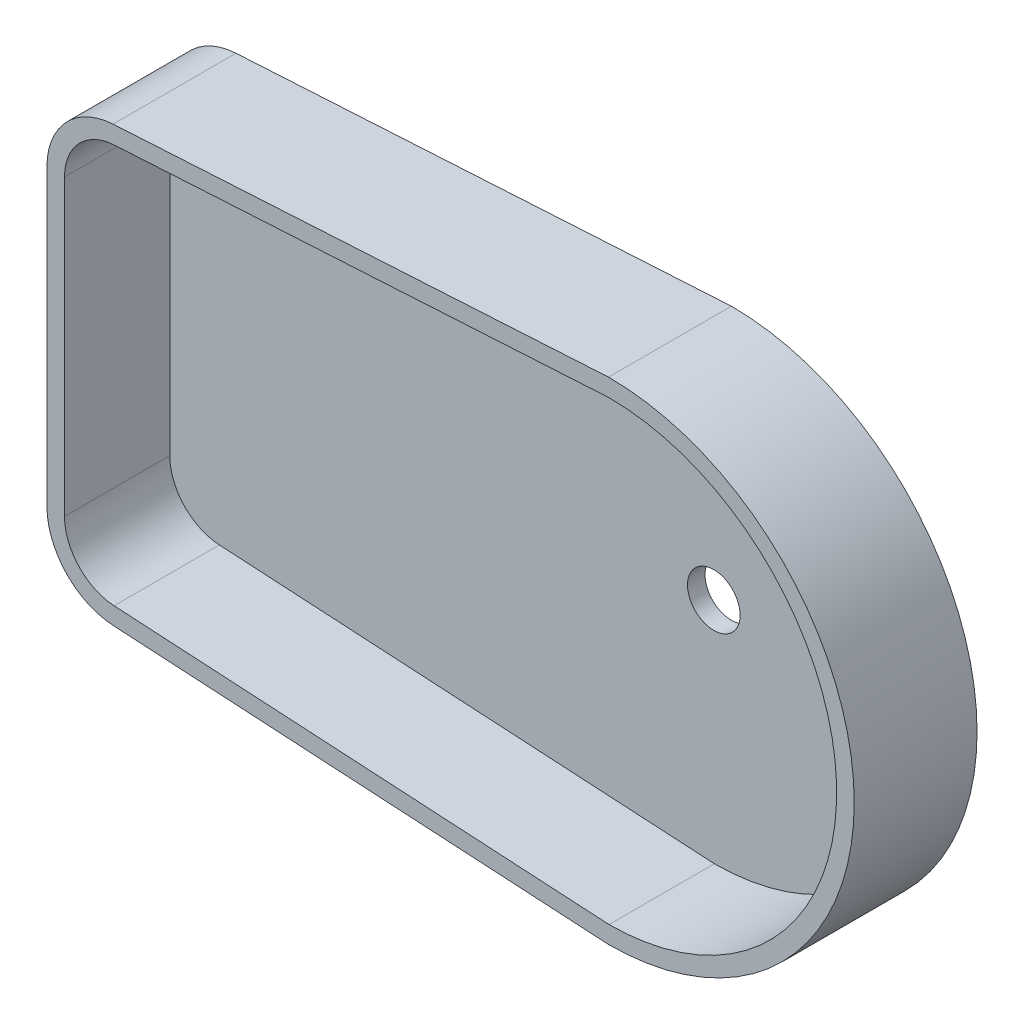
ISO-10303-21;
HEADER;
FILE_DESCRIPTION(('STEP AP214'),'2;1');
FILE_NAME('part.step','',(''),(''),'','','');
FILE_SCHEMA(('AUTOMOTIVE_DESIGN { 1 0 10303 214 1 1 1 1 }'));
ENDSEC;
DATA;
#1=APPLICATION_CONTEXT('core data for automotive mechanical design processes');
#2=APPLICATION_PROTOCOL_DEFINITION('international standard','automotive_design',2000,#1);
#3=PRODUCT_CONTEXT('',#1,'mechanical');
#4=PRODUCT('Part','Part','',(#3));
#5=PRODUCT_RELATED_PRODUCT_CATEGORY('part','',(#4));
#6=PRODUCT_DEFINITION_FORMATION('','',#4);
#7=PRODUCT_DEFINITION_CONTEXT('part definition',#1,'design');
#8=PRODUCT_DEFINITION('design','',#6,#7);
#9=PRODUCT_DEFINITION_SHAPE('','',#8);
#10=(LENGTH_UNIT() NAMED_UNIT(*) SI_UNIT(.MILLI.,.METRE.));
#11=(NAMED_UNIT(*) PLANE_ANGLE_UNIT() SI_UNIT($,.RADIAN.));
#12=(NAMED_UNIT(*) SI_UNIT($,.STERADIAN.) SOLID_ANGLE_UNIT());
#13=UNCERTAINTY_MEASURE_WITH_UNIT(LENGTH_MEASURE(1.E-05),#10,'distance_accuracy_value','');
#14=(GEOMETRIC_REPRESENTATION_CONTEXT(3) GLOBAL_UNCERTAINTY_ASSIGNED_CONTEXT((#13)) GLOBAL_UNIT_ASSIGNED_CONTEXT((#10,
#11,#12)) REPRESENTATION_CONTEXT('',''));
#15=CARTESIAN_POINT('',(0.,0.,0.));
#16=DIRECTION('',(0.,0.,1.));
#17=DIRECTION('',(1.,0.,0.));
#18=AXIS2_PLACEMENT_3D('',#15,#16,#17);
#19=CARTESIAN_POINT('',(160.,0.,17.5));
#20=DIRECTION('',(0.,0.,-1.));
#21=DIRECTION('',(-1.,0.,0.));
#22=AXIS2_PLACEMENT_3D('',#19,#20,#21);
#23=CYLINDRICAL_SURFACE('',#22,70.);
#24=CARTESIAN_POINT('',(160.,0.,-17.5));
#25=DIRECTION('',(0.,0.,1.));
#26=DIRECTION('',(1.,0.,0.));
#27=AXIS2_PLACEMENT_3D('',#24,#25,#26);
#28=CIRCLE('',#27,70.);
#29=CARTESIAN_POINT('',(160.,-70.,-17.5));
#30=VERTEX_POINT('',#29);
#31=CARTESIAN_POINT('',(160.,70.,-17.5));
#32=VERTEX_POINT('',#31);
#33=EDGE_CURVE('E138',#30,#32,#28,.T.);
#34=ORIENTED_EDGE('',*,*,#33,.T.);
#35=DIRECTION('',(0.,0.,-1.));
#36=VECTOR('',#35,1.);
#37=CARTESIAN_POINT('',(160.,70.,17.5));
#38=LINE('',#37,#36);
#39=CARTESIAN_POINT('',(160.,70.,17.5));
#40=VERTEX_POINT('',#39);
#41=EDGE_CURVE('E11',#40,#32,#38,.T.);
#42=ORIENTED_EDGE('',*,*,#41,.F.);
#43=CARTESIAN_POINT('',(160.,0.,17.5));
#44=DIRECTION('',(0.,0.,1.));
#45=DIRECTION('',(1.,0.,0.));
#46=AXIS2_PLACEMENT_3D('',#43,#44,#45);
#47=CIRCLE('',#46,70.);
#48=CARTESIAN_POINT('',(160.,-70.,17.5));
#49=VERTEX_POINT('',#48);
#50=EDGE_CURVE('E150',#49,#40,#47,.T.);
#51=ORIENTED_EDGE('',*,*,#50,.F.);
#52=DIRECTION('',(0.,0.,-1.));
#53=VECTOR('',#52,1.);
#54=CARTESIAN_POINT('',(160.,-70.,17.5));
#55=LINE('',#54,#53);
#56=EDGE_CURVE('E134',#49,#30,#55,.T.);
#57=ORIENTED_EDGE('',*,*,#56,.T.);
#58=EDGE_LOOP('',(#34,#42,#51,#57));
#59=FACE_BOUND('',#58,.T.);
#60=ADVANCED_FACE('F41',(#59),#23,.T.);
#61=CARTESIAN_POINT('',(18.845677428438,61.8395157263316,17.5));
#62=DIRECTION('',(0.0577161285781097,-0.998333034864596,0.));
#63=DIRECTION('',(0.998333034864596,0.0577161285781097,0.));
#64=AXIS2_PLACEMENT_3D('',#61,#62,#63);
#65=PLANE('',#64);
#66=DIRECTION('',(-0.998333034864596,-0.0577161285781097,0.));
#67=VECTOR('',#66,1.);
#68=CARTESIAN_POINT('',(18.845677428438,61.8395157263316,-17.5));
#69=LINE('',#68,#67);
#70=CARTESIAN_POINT('',(18.845677428438,61.8395157263316,-17.5));
#71=VERTEX_POINT('',#70);
#72=EDGE_CURVE('E141',#32,#71,#69,.T.);
#73=ORIENTED_EDGE('',*,*,#72,.T.);
#74=DIRECTION('',(0.,0.,-1.));
#75=VECTOR('',#74,1.);
#76=CARTESIAN_POINT('',(18.845677428438,61.8395157263316,17.5));
#77=LINE('',#76,#75);
#78=CARTESIAN_POINT('',(18.845677428438,61.8395157263316,17.5));
#79=VERTEX_POINT('',#78);
#80=EDGE_CURVE('E49',#79,#71,#77,.T.);
#81=ORIENTED_EDGE('',*,*,#80,.F.);
#82=DIRECTION('',(-0.998333034864596,-0.0577161285781097,0.));
#83=VECTOR('',#82,1.);
#84=CARTESIAN_POINT('',(18.845677428438,61.8395157263316,17.5));
#85=LINE('',#84,#83);
#86=EDGE_CURVE('E100',#40,#79,#85,.T.);
#87=ORIENTED_EDGE('',*,*,#86,.F.);
#88=ORIENTED_EDGE('',*,*,#41,.T.);
#89=EDGE_LOOP('',(#73,#81,#87,#88));
#90=FACE_BOUND('',#89,.T.);
#91=ADVANCED_FACE('F285',(#90),#65,.F.);
#92=CARTESIAN_POINT('',(20.,41.8728550290396,17.5));
#93=DIRECTION('',(0.,0.,-1.));
#94=DIRECTION('',(-1.,0.,0.));
#95=AXIS2_PLACEMENT_3D('',#92,#93,#94);
#96=CYLINDRICAL_SURFACE('',#95,20.);
#97=CARTESIAN_POINT('',(20.,41.8728550290396,-17.5));
#98=DIRECTION('',(0.,0.,1.));
#99=DIRECTION('',(1.,0.,0.));
#100=AXIS2_PLACEMENT_3D('',#97,#98,#99);
#101=CIRCLE('',#100,20.);
#102=CARTESIAN_POINT('',(0.,41.8728550290395,-17.5));
#103=VERTEX_POINT('',#102);
#104=EDGE_CURVE('E144',#71,#103,#101,.T.);
#105=ORIENTED_EDGE('',*,*,#104,.T.);
#106=DIRECTION('',(0.,0.,-1.));
#107=VECTOR('',#106,1.);
#108=CARTESIAN_POINT('',(0.,41.8728550290395,17.5));
#109=LINE('',#108,#107);
#110=CARTESIAN_POINT('',(0.,41.8728550290395,17.5));
#111=VERTEX_POINT('',#110);
#112=EDGE_CURVE('E129',#111,#103,#109,.T.);
#113=ORIENTED_EDGE('',*,*,#112,.F.);
#114=CARTESIAN_POINT('',(20.,41.8728550290396,17.5));
#115=DIRECTION('',(0.,0.,1.));
#116=DIRECTION('',(1.,0.,0.));
#117=AXIS2_PLACEMENT_3D('',#114,#115,#116);
#118=CIRCLE('',#117,20.);
#119=EDGE_CURVE('E117',#79,#111,#118,.T.);
#120=ORIENTED_EDGE('',*,*,#119,.F.);
#121=ORIENTED_EDGE('',*,*,#80,.T.);
#122=EDGE_LOOP('',(#105,#113,#120,#121));
#123=FACE_BOUND('',#122,.T.);
#124=ADVANCED_FACE('F157',(#123),#96,.T.);
#125=CARTESIAN_POINT('',(0.,41.8728550290395,17.5));
#126=DIRECTION('',(1.,0.,0.));
#127=DIRECTION('',(0.,0.,-1.));
#128=AXIS2_PLACEMENT_3D('',#125,#126,#127);
#129=PLANE('',#128);
#130=DIRECTION('',(0.,-1.,0.));
#131=VECTOR('',#130,1.);
#132=CARTESIAN_POINT('',(0.,41.8728550290395,-17.5));
#133=LINE('',#132,#131);
#134=CARTESIAN_POINT('',(0.,-41.8728550290396,-17.5));
#135=VERTEX_POINT('',#134);
#136=EDGE_CURVE('E126',#103,#135,#133,.T.);
#137=ORIENTED_EDGE('',*,*,#136,.T.);
#138=DIRECTION('',(0.,0.,-1.));
#139=VECTOR('',#138,1.);
#140=CARTESIAN_POINT('',(0.,-41.8728550290396,17.5));
#141=LINE('',#140,#139);
#142=CARTESIAN_POINT('',(0.,-41.8728550290396,17.5));
#143=VERTEX_POINT('',#142);
#144=EDGE_CURVE('E123',#143,#135,#141,.T.);
#145=ORIENTED_EDGE('',*,*,#144,.F.);
#146=DIRECTION('',(0.,-1.,0.));
#147=VECTOR('',#146,1.);
#148=CARTESIAN_POINT('',(0.,41.8728550290395,17.5));
#149=LINE('',#148,#147);
#150=EDGE_CURVE('E110',#111,#143,#149,.T.);
#151=ORIENTED_EDGE('',*,*,#150,.F.);
#152=ORIENTED_EDGE('',*,*,#112,.T.);
#153=EDGE_LOOP('',(#137,#145,#151,#152));
#154=FACE_BOUND('',#153,.T.);
#155=ADVANCED_FACE('F124',(#154),#129,.F.);
#156=CARTESIAN_POINT('',(20.,-41.8728550290396,17.5));
#157=DIRECTION('',(0.,0.,-1.));
#158=DIRECTION('',(-1.,0.,0.));
#159=AXIS2_PLACEMENT_3D('',#156,#157,#158);
#160=CYLINDRICAL_SURFACE('',#159,20.);
#161=CARTESIAN_POINT('',(20.,-41.8728550290396,-17.5));
#162=DIRECTION('',(0.,0.,1.));
#163=DIRECTION('',(-1.,0.,0.));
#164=AXIS2_PLACEMENT_3D('',#161,#162,#163);
#165=CIRCLE('',#164,20.);
#166=CARTESIAN_POINT('',(18.845677428438,-61.8395157263316,-17.5));
#167=VERTEX_POINT('',#166);
#168=EDGE_CURVE('E147',#135,#167,#165,.T.);
#169=ORIENTED_EDGE('',*,*,#168,.T.);
#170=DIRECTION('',(0.,0.,-1.));
#171=VECTOR('',#170,1.);
#172=CARTESIAN_POINT('',(18.845677428438,-61.8395157263316,17.5));
#173=LINE('',#172,#171);
#174=CARTESIAN_POINT('',(18.845677428438,-61.8395157263316,17.5));
#175=VERTEX_POINT('',#174);
#176=EDGE_CURVE('E130',#175,#167,#173,.T.);
#177=ORIENTED_EDGE('',*,*,#176,.F.);
#178=CARTESIAN_POINT('',(20.,-41.8728550290396,17.5));
#179=DIRECTION('',(0.,0.,1.));
#180=DIRECTION('',(-1.,0.,0.));
#181=AXIS2_PLACEMENT_3D('',#178,#179,#180);
#182=CIRCLE('',#181,20.);
#183=EDGE_CURVE('E114',#143,#175,#182,.T.);
#184=ORIENTED_EDGE('',*,*,#183,.F.);
#185=ORIENTED_EDGE('',*,*,#144,.T.);
#186=EDGE_LOOP('',(#169,#177,#184,#185));
#187=FACE_BOUND('',#186,.T.);
#188=ADVANCED_FACE('F132',(#187),#160,.T.);
#189=CARTESIAN_POINT('',(18.845677428438,-61.8395157263316,17.5));
#190=DIRECTION('',(0.0577161285781095,0.998333034864596,0.));
#191=DIRECTION('',(-0.998333034864596,0.0577161285781095,0.));
#192=AXIS2_PLACEMENT_3D('',#189,#190,#191);
#193=PLANE('',#192);
#194=DIRECTION('',(0.998333034864596,-0.0577161285781095,0.));
#195=VECTOR('',#194,1.);
#196=CARTESIAN_POINT('',(18.845677428438,-61.8395157263316,-17.5));
#197=LINE('',#196,#195);
#198=EDGE_CURVE('E92',#167,#30,#197,.T.);
#199=ORIENTED_EDGE('',*,*,#198,.T.);
#200=ORIENTED_EDGE('',*,*,#56,.F.);
#201=DIRECTION('',(0.998333034864596,-0.0577161285781095,0.));
#202=VECTOR('',#201,1.);
#203=CARTESIAN_POINT('',(18.845677428438,-61.8395157263316,17.5));
#204=LINE('',#203,#202);
#205=EDGE_CURVE('E65',#175,#49,#204,.T.);
#206=ORIENTED_EDGE('',*,*,#205,.F.);
#207=ORIENTED_EDGE('',*,*,#176,.T.);
#208=EDGE_LOOP('',(#199,#200,#206,#207));
#209=FACE_BOUND('',#208,.T.);
#210=ADVANCED_FACE('F161',(#209),#193,.F.);
#211=CARTESIAN_POINT('',(160.,0.,17.5));
#212=DIRECTION('',(0.,0.,1.));
#213=DIRECTION('',(1.,0.,0.));
#214=AXIS2_PLACEMENT_3D('',#211,#212,#213);
#215=PLANE('',#214);
#216=CARTESIAN_POINT('',(160.,0.,17.5));
#217=DIRECTION('',(0.,0.,1.));
#218=DIRECTION('',(1.,0.,0.));
#219=AXIS2_PLACEMENT_3D('',#216,#217,#218);
#220=CIRCLE('',#219,65.);
#221=CARTESIAN_POINT('',(160.141737642964,-64.9998454647437,17.5));
#222=VERTEX_POINT('',#221);
#223=CARTESIAN_POINT('',(160.141737642964,64.9998454647438,17.5));
#224=VERTEX_POINT('',#223);
#225=EDGE_CURVE('E56',#222,#224,#220,.T.);
#226=ORIENTED_EDGE('',*,*,#225,.F.);
#227=DIRECTION('',(0.998333034864596,-0.0577161285781095,0.));
#228=VECTOR('',#227,1.);
#229=CARTESIAN_POINT('',(19.1342580713285,-56.8478505520086,17.5));
#230=LINE('',#229,#228);
#231=CARTESIAN_POINT('',(19.1342580713285,-56.8478505520086,17.5));
#232=VERTEX_POINT('',#231);
#233=EDGE_CURVE('E184',#232,#222,#230,.T.);
#234=ORIENTED_EDGE('',*,*,#233,.F.);
#235=CARTESIAN_POINT('',(20.,-41.8728550290396,17.5));
#236=DIRECTION('',(0.,0.,1.));
#237=DIRECTION('',(1.,0.,0.));
#238=AXIS2_PLACEMENT_3D('',#235,#236,#237);
#239=CIRCLE('',#238,15.);
#240=CARTESIAN_POINT('',(5.00000000000002,-41.8728550290396,17.5));
#241=VERTEX_POINT('',#240);
#242=EDGE_CURVE('E188',#241,#232,#239,.T.);
#243=ORIENTED_EDGE('',*,*,#242,.F.);
#244=DIRECTION('',(0.,-1.,0.));
#245=VECTOR('',#244,1.);
#246=CARTESIAN_POINT('',(5.00000000000002,41.8728550290395,17.5));
#247=LINE('',#246,#245);
#248=CARTESIAN_POINT('',(5.00000000000002,41.8728550290395,17.5));
#249=VERTEX_POINT('',#248);
#250=EDGE_CURVE('E191',#249,#241,#247,.T.);
#251=ORIENTED_EDGE('',*,*,#250,.F.);
#252=CARTESIAN_POINT('',(20.,41.8728550290396,17.5));
#253=DIRECTION('',(0.,0.,1.));
#254=DIRECTION('',(1.,0.,0.));
#255=AXIS2_PLACEMENT_3D('',#252,#253,#254);
#256=CIRCLE('',#255,15.);
#257=CARTESIAN_POINT('',(19.1342580713285,56.8478505520086,17.5));
#258=VERTEX_POINT('',#257);
#259=EDGE_CURVE('E194',#258,#249,#256,.T.);
#260=ORIENTED_EDGE('',*,*,#259,.F.);
#261=DIRECTION('',(-0.998333034864596,-0.0577161285781096,0.));
#262=VECTOR('',#261,1.);
#263=CARTESIAN_POINT('',(160.141737642964,64.9998454647438,17.5));
#264=LINE('',#263,#262);
#265=EDGE_CURVE('E197',#224,#258,#264,.T.);
#266=ORIENTED_EDGE('',*,*,#265,.F.);
#267=EDGE_LOOP('',(#226,#234,#243,#251,#260,#266));
#268=FACE_BOUND('',#267,.T.);
#269=ORIENTED_EDGE('',*,*,#50,.T.);
#270=ORIENTED_EDGE('',*,*,#86,.T.);
#271=ORIENTED_EDGE('',*,*,#119,.T.);
#272=ORIENTED_EDGE('',*,*,#150,.T.);
#273=ORIENTED_EDGE('',*,*,#183,.T.);
#274=ORIENTED_EDGE('',*,*,#205,.T.);
#275=EDGE_LOOP('',(#269,#270,#271,#272,#273,#274));
#276=FACE_BOUND('',#275,.T.);
#277=ADVANCED_FACE('F112',(#268,#276),#215,.T.);
#278=CARTESIAN_POINT('',(160.,0.,-17.5));
#279=DIRECTION('',(0.,0.,1.));
#280=DIRECTION('',(1.,0.,0.));
#281=AXIS2_PLACEMENT_3D('',#278,#279,#280);
#282=PLANE('',#281);
#283=CARTESIAN_POINT('',(160.,0.,-17.5));
#284=DIRECTION('',(0.,0.,-1.));
#285=DIRECTION('',(-1.,0.,0.));
#286=AXIS2_PLACEMENT_3D('',#283,#284,#285);
#287=CIRCLE('',#286,7.50000000000001);
#288=CARTESIAN_POINT('',(152.5,0.,-17.5));
#289=VERTEX_POINT('',#288);
#290=EDGE_CURVE('E217',#289,#289,#287,.T.);
#291=ORIENTED_EDGE('',*,*,#290,.F.);
#292=EDGE_LOOP('',(#291));
#293=FACE_BOUND('',#292,.T.);
#294=ORIENTED_EDGE('',*,*,#33,.F.);
#295=ORIENTED_EDGE('',*,*,#198,.F.);
#296=ORIENTED_EDGE('',*,*,#168,.F.);
#297=ORIENTED_EDGE('',*,*,#136,.F.);
#298=ORIENTED_EDGE('',*,*,#104,.F.);
#299=ORIENTED_EDGE('',*,*,#72,.F.);
#300=EDGE_LOOP('',(#294,#295,#296,#297,#298,#299));
#301=FACE_BOUND('',#300,.T.);
#302=ADVANCED_FACE('F160',(#293,#301),#282,.F.);
#303=CARTESIAN_POINT('',(160.,0.,-12.5));
#304=DIRECTION('',(0.,0.,1.));
#305=DIRECTION('',(1.,0.,0.));
#306=AXIS2_PLACEMENT_3D('',#303,#304,#305);
#307=CYLINDRICAL_SURFACE('',#306,65.);
#308=ORIENTED_EDGE('',*,*,#225,.T.);
#309=DIRECTION('',(0.,0.,1.));
#310=VECTOR('',#309,1.);
#311=CARTESIAN_POINT('',(160.141737642964,64.9998454647438,-12.5));
#312=LINE('',#311,#310);
#313=CARTESIAN_POINT('',(160.141737642964,64.9998454647438,-12.5));
#314=VERTEX_POINT('',#313);
#315=EDGE_CURVE('E168',#314,#224,#312,.T.);
#316=ORIENTED_EDGE('',*,*,#315,.F.);
#317=CARTESIAN_POINT('',(160.,0.,-12.5));
#318=DIRECTION('',(0.,0.,1.));
#319=DIRECTION('',(1.,0.,0.));
#320=AXIS2_PLACEMENT_3D('',#317,#318,#319);
#321=CIRCLE('',#320,65.);
#322=CARTESIAN_POINT('',(160.141737642964,-64.9998454647437,-12.5));
#323=VERTEX_POINT('',#322);
#324=EDGE_CURVE('E187',#323,#314,#321,.T.);
#325=ORIENTED_EDGE('',*,*,#324,.F.);
#326=DIRECTION('',(0.,0.,1.));
#327=VECTOR('',#326,1.);
#328=CARTESIAN_POINT('',(160.141737642964,-64.9998454647437,-12.5));
#329=LINE('',#328,#327);
#330=EDGE_CURVE('E142',#323,#222,#329,.T.);
#331=ORIENTED_EDGE('',*,*,#330,.T.);
#332=EDGE_LOOP('',(#308,#316,#325,#331));
#333=FACE_BOUND('',#332,.T.);
#334=ADVANCED_FACE('F237',(#333),#307,.F.);
#335=CARTESIAN_POINT('',(19.1342580713285,-56.8478505520086,-12.5));
#336=DIRECTION('',(-0.0577161285781095,-0.998333034864596,0.));
#337=DIRECTION('',(0.998333034864596,-0.0577161285781095,0.));
#338=AXIS2_PLACEMENT_3D('',#335,#336,#337);
#339=PLANE('',#338);
#340=ORIENTED_EDGE('',*,*,#233,.T.);
#341=ORIENTED_EDGE('',*,*,#330,.F.);
#342=DIRECTION('',(0.998333034864596,-0.0577161285781095,0.));
#343=VECTOR('',#342,1.);
#344=CARTESIAN_POINT('',(19.1342580713285,-56.8478505520086,-12.5));
#345=LINE('',#344,#343);
#346=CARTESIAN_POINT('',(19.1342580713285,-56.8478505520086,-12.5));
#347=VERTEX_POINT('',#346);
#348=EDGE_CURVE('E171',#347,#323,#345,.T.);
#349=ORIENTED_EDGE('',*,*,#348,.F.);
#350=DIRECTION('',(0.,0.,1.));
#351=VECTOR('',#350,1.);
#352=CARTESIAN_POINT('',(19.1342580713285,-56.8478505520086,-12.5));
#353=LINE('',#352,#351);
#354=EDGE_CURVE('E180',#347,#232,#353,.T.);
#355=ORIENTED_EDGE('',*,*,#354,.T.);
#356=EDGE_LOOP('',(#340,#341,#349,#355));
#357=FACE_BOUND('',#356,.T.);
#358=ADVANCED_FACE('F253',(#357),#339,.F.);
#359=CARTESIAN_POINT('',(20.,-41.8728550290396,-12.5));
#360=DIRECTION('',(0.,0.,1.));
#361=DIRECTION('',(1.,0.,0.));
#362=AXIS2_PLACEMENT_3D('',#359,#360,#361);
#363=CYLINDRICAL_SURFACE('',#362,15.);
#364=ORIENTED_EDGE('',*,*,#242,.T.);
#365=ORIENTED_EDGE('',*,*,#354,.F.);
#366=CARTESIAN_POINT('',(20.,-41.8728550290396,-12.5));
#367=DIRECTION('',(0.,0.,1.));
#368=DIRECTION('',(1.,0.,0.));
#369=AXIS2_PLACEMENT_3D('',#366,#367,#368);
#370=CIRCLE('',#369,15.);
#371=CARTESIAN_POINT('',(5.00000000000002,-41.8728550290396,-12.5));
#372=VERTEX_POINT('',#371);
#373=EDGE_CURVE('E203',#372,#347,#370,.T.);
#374=ORIENTED_EDGE('',*,*,#373,.F.);
#375=DIRECTION('',(0.,0.,1.));
#376=VECTOR('',#375,1.);
#377=CARTESIAN_POINT('',(5.00000000000002,-41.8728550290396,-12.5));
#378=LINE('',#377,#376);
#379=EDGE_CURVE('E177',#372,#241,#378,.T.);
#380=ORIENTED_EDGE('',*,*,#379,.T.);
#381=EDGE_LOOP('',(#364,#365,#374,#380));
#382=FACE_BOUND('',#381,.T.);
#383=ADVANCED_FACE('F258',(#382),#363,.F.);
#384=CARTESIAN_POINT('',(5.00000000000002,41.8728550290395,-12.5));
#385=DIRECTION('',(-1.,0.,0.));
#386=DIRECTION('',(0.,-1.,0.));
#387=AXIS2_PLACEMENT_3D('',#384,#385,#386);
#388=PLANE('',#387);
#389=ORIENTED_EDGE('',*,*,#250,.T.);
#390=ORIENTED_EDGE('',*,*,#379,.F.);
#391=DIRECTION('',(0.,-1.,0.));
#392=VECTOR('',#391,1.);
#393=CARTESIAN_POINT('',(5.00000000000002,41.8728550290395,-12.5));
#394=LINE('',#393,#392);
#395=CARTESIAN_POINT('',(5.00000000000002,41.8728550290395,-12.5));
#396=VERTEX_POINT('',#395);
#397=EDGE_CURVE('E206',#396,#372,#394,.T.);
#398=ORIENTED_EDGE('',*,*,#397,.F.);
#399=DIRECTION('',(0.,0.,1.));
#400=VECTOR('',#399,1.);
#401=CARTESIAN_POINT('',(5.00000000000002,41.8728550290395,-12.5));
#402=LINE('',#401,#400);
#403=EDGE_CURVE('E174',#396,#249,#402,.T.);
#404=ORIENTED_EDGE('',*,*,#403,.T.);
#405=EDGE_LOOP('',(#389,#390,#398,#404));
#406=FACE_BOUND('',#405,.T.);
#407=ADVANCED_FACE('F275',(#406),#388,.F.);
#408=CARTESIAN_POINT('',(20.,41.8728550290396,-12.5));
#409=DIRECTION('',(0.,0.,1.));
#410=DIRECTION('',(1.,0.,0.));
#411=AXIS2_PLACEMENT_3D('',#408,#409,#410);
#412=CYLINDRICAL_SURFACE('',#411,15.);
#413=ORIENTED_EDGE('',*,*,#259,.T.);
#414=ORIENTED_EDGE('',*,*,#403,.F.);
#415=CARTESIAN_POINT('',(20.,41.8728550290396,-12.5));
#416=DIRECTION('',(0.,0.,1.));
#417=DIRECTION('',(1.,0.,0.));
#418=AXIS2_PLACEMENT_3D('',#415,#416,#417);
#419=CIRCLE('',#418,15.);
#420=CARTESIAN_POINT('',(19.1342580713285,56.8478505520086,-12.5));
#421=VERTEX_POINT('',#420);
#422=EDGE_CURVE('E209',#421,#396,#419,.T.);
#423=ORIENTED_EDGE('',*,*,#422,.F.);
#424=DIRECTION('',(0.,0.,1.));
#425=VECTOR('',#424,1.);
#426=CARTESIAN_POINT('',(19.1342580713285,56.8478505520086,-12.5));
#427=LINE('',#426,#425);
#428=EDGE_CURVE('E170',#421,#258,#427,.T.);
#429=ORIENTED_EDGE('',*,*,#428,.T.);
#430=EDGE_LOOP('',(#413,#414,#423,#429));
#431=FACE_BOUND('',#430,.T.);
#432=ADVANCED_FACE('F271',(#431),#412,.F.);
#433=CARTESIAN_POINT('',(160.141737642964,64.9998454647438,-12.5));
#434=DIRECTION('',(-0.0577161285781096,0.998333034864596,0.));
#435=DIRECTION('',(-0.998333034864596,-0.0577161285781096,0.));
#436=AXIS2_PLACEMENT_3D('',#433,#434,#435);
#437=PLANE('',#436);
#438=ORIENTED_EDGE('',*,*,#265,.T.);
#439=ORIENTED_EDGE('',*,*,#428,.F.);
#440=DIRECTION('',(-0.998333034864596,-0.0577161285781096,0.));
#441=VECTOR('',#440,1.);
#442=CARTESIAN_POINT('',(160.141737642964,64.9998454647438,-12.5));
#443=LINE('',#442,#441);
#444=EDGE_CURVE('E212',#314,#421,#443,.T.);
#445=ORIENTED_EDGE('',*,*,#444,.F.);
#446=ORIENTED_EDGE('',*,*,#315,.T.);
#447=EDGE_LOOP('',(#438,#439,#445,#446));
#448=FACE_BOUND('',#447,.T.);
#449=ADVANCED_FACE('F229',(#448),#437,.F.);
#450=CARTESIAN_POINT('',(160.,0.,-12.5));
#451=DIRECTION('',(0.,0.,1.));
#452=DIRECTION('',(1.,0.,0.));
#453=AXIS2_PLACEMENT_3D('',#450,#451,#452);
#454=PLANE('',#453);
#455=CARTESIAN_POINT('',(160.,0.,-12.5));
#456=DIRECTION('',(0.,0.,1.));
#457=DIRECTION('',(1.,0.,0.));
#458=AXIS2_PLACEMENT_3D('',#455,#456,#457);
#459=CIRCLE('',#458,7.50000000000001);
#460=CARTESIAN_POINT('',(167.5,0.,-12.5));
#461=VERTEX_POINT('',#460);
#462=EDGE_CURVE('E44',#461,#461,#459,.T.);
#463=ORIENTED_EDGE('',*,*,#462,.F.);
#464=EDGE_LOOP('',(#463));
#465=FACE_BOUND('',#464,.T.);
#466=ORIENTED_EDGE('',*,*,#324,.T.);
#467=ORIENTED_EDGE('',*,*,#444,.T.);
#468=ORIENTED_EDGE('',*,*,#422,.T.);
#469=ORIENTED_EDGE('',*,*,#397,.T.);
#470=ORIENTED_EDGE('',*,*,#373,.T.);
#471=ORIENTED_EDGE('',*,*,#348,.T.);
#472=EDGE_LOOP('',(#466,#467,#468,#469,#470,#471));
#473=FACE_BOUND('',#472,.T.);
#474=ADVANCED_FACE('F226',(#465,#473),#454,.T.);
#475=CARTESIAN_POINT('',(160.,0.,-7.5));
#476=DIRECTION('',(0.,0.,-1.));
#477=DIRECTION('',(-1.,0.,0.));
#478=AXIS2_PLACEMENT_3D('',#475,#476,#477);
#479=CYLINDRICAL_SURFACE('',#478,7.50000000000001);
#480=ORIENTED_EDGE('',*,*,#462,.T.);
#481=EDGE_LOOP('',(#480));
#482=FACE_BOUND('',#481,.T.);
#483=ORIENTED_EDGE('',*,*,#290,.T.);
#484=EDGE_LOOP('',(#483));
#485=FACE_BOUND('',#484,.T.);
#486=ADVANCED_FACE('F224',(#482,#485),#479,.F.);
#487=CLOSED_SHELL('',(#60,#91,#124,#155,#188,#210,#277,#302,#334,#358,#383,#407,#432,#449,#474,#486));
#488=MANIFOLD_SOLID_BREP('B2',#487);
#489=ADVANCED_BREP_SHAPE_REPRESENTATION('',(#18,#488),#14);
#490=SHAPE_DEFINITION_REPRESENTATION(#9,#489);
ENDSEC;
END-ISO-10303-21;
